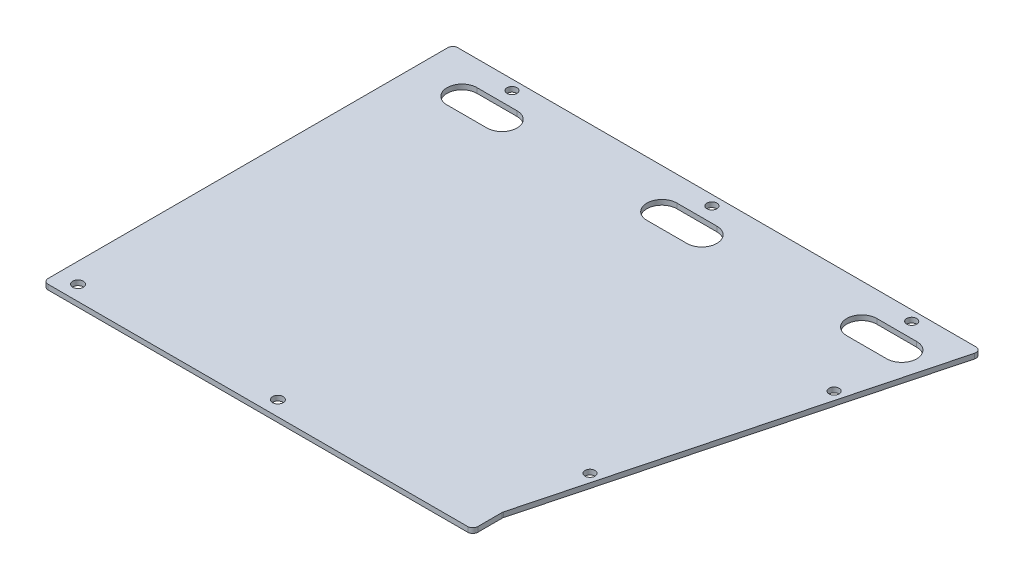
ISO-10303-21;
HEADER;
FILE_DESCRIPTION(('STEP AP214'),'2;1');
FILE_NAME('part.step','',(''),(''),'','','');
FILE_SCHEMA(('AUTOMOTIVE_DESIGN { 1 0 10303 214 1 1 1 1 }'));
ENDSEC;
DATA;
#1=APPLICATION_CONTEXT('core data for automotive mechanical design processes');
#2=APPLICATION_PROTOCOL_DEFINITION('international standard','automotive_design',2000,#1);
#3=PRODUCT_CONTEXT('',#1,'mechanical');
#4=PRODUCT('Part','Part','',(#3));
#5=PRODUCT_RELATED_PRODUCT_CATEGORY('part','',(#4));
#6=PRODUCT_DEFINITION_FORMATION('','',#4);
#7=PRODUCT_DEFINITION_CONTEXT('part definition',#1,'design');
#8=PRODUCT_DEFINITION('design','',#6,#7);
#9=PRODUCT_DEFINITION_SHAPE('','',#8);
#10=(LENGTH_UNIT() NAMED_UNIT(*) SI_UNIT(.MILLI.,.METRE.));
#11=(NAMED_UNIT(*) PLANE_ANGLE_UNIT() SI_UNIT($,.RADIAN.));
#12=(NAMED_UNIT(*) SI_UNIT($,.STERADIAN.) SOLID_ANGLE_UNIT());
#13=UNCERTAINTY_MEASURE_WITH_UNIT(LENGTH_MEASURE(1.E-05),#10,'distance_accuracy_value','');
#14=(GEOMETRIC_REPRESENTATION_CONTEXT(3) GLOBAL_UNCERTAINTY_ASSIGNED_CONTEXT((#13)) GLOBAL_UNIT_ASSIGNED_CONTEXT((#10,
#11,#12)) REPRESENTATION_CONTEXT('',''));
#15=CARTESIAN_POINT('',(0.,0.,0.));
#16=DIRECTION('',(0.,0.,1.));
#17=DIRECTION('',(1.,0.,0.));
#18=AXIS2_PLACEMENT_3D('',#15,#16,#17);
#19=CARTESIAN_POINT('',(0.,3.175,-260.35));
#20=DIRECTION('',(1.,0.,0.));
#21=DIRECTION('',(0.,0.,-1.));
#22=AXIS2_PLACEMENT_3D('',#19,#20,#21);
#23=PLANE('',#22);
#24=DIRECTION('',(0.,0.,1.));
#25=VECTOR('',#24,1.);
#26=CARTESIAN_POINT('',(0.,3.175,-260.35));
#27=LINE('',#26,#25);
#28=CARTESIAN_POINT('',(0.,3.175,-257.175));
#29=VERTEX_POINT('',#28);
#30=CARTESIAN_POINT('',(0.,3.175,-3.17499999999998));
#31=VERTEX_POINT('',#30);
#32=EDGE_CURVE('E327',#29,#31,#27,.T.);
#33=ORIENTED_EDGE('',*,*,#32,.F.);
#34=DIRECTION('',(0.,-1.,0.));
#35=VECTOR('',#34,1.);
#36=CARTESIAN_POINT('',(0.,3.175,-257.175));
#37=LINE('',#36,#35);
#38=CARTESIAN_POINT('',(0.,0.,-257.175));
#39=VERTEX_POINT('',#38);
#40=EDGE_CURVE('E384',#29,#39,#37,.T.);
#41=ORIENTED_EDGE('',*,*,#40,.T.);
#42=DIRECTION('',(0.,0.,1.));
#43=VECTOR('',#42,1.);
#44=CARTESIAN_POINT('',(0.,0.,-260.35));
#45=LINE('',#44,#43);
#46=CARTESIAN_POINT('',(0.,0.,-3.17499999999998));
#47=VERTEX_POINT('',#46);
#48=EDGE_CURVE('E326',#39,#47,#45,.T.);
#49=ORIENTED_EDGE('',*,*,#48,.T.);
#50=DIRECTION('',(0.,-1.,0.));
#51=VECTOR('',#50,1.);
#52=CARTESIAN_POINT('',(0.,3.175,-3.17499999999998));
#53=LINE('',#52,#51);
#54=EDGE_CURVE('E382',#47,#31,#53,.F.);
#55=ORIENTED_EDGE('',*,*,#54,.T.);
#56=EDGE_LOOP('',(#33,#41,#49,#55));
#57=FACE_BOUND('',#56,.T.);
#58=ADVANCED_FACE('F33',(#57),#23,.F.);
#59=CARTESIAN_POINT('',(0.,3.175,0.));
#60=DIRECTION('',(0.,0.,-1.));
#61=DIRECTION('',(-1.,0.,0.));
#62=AXIS2_PLACEMENT_3D('',#59,#60,#61);
#63=PLANE('',#62);
#64=DIRECTION('',(1.,0.,0.));
#65=VECTOR('',#64,1.);
#66=CARTESIAN_POINT('',(0.,3.175,0.));
#67=LINE('',#66,#65);
#68=CARTESIAN_POINT('',(3.175,3.175,0.));
#69=VERTEX_POINT('',#68);
#70=CARTESIAN_POINT('',(269.875,3.175,0.));
#71=VERTEX_POINT('',#70);
#72=EDGE_CURVE('E330',#69,#71,#67,.T.);
#73=ORIENTED_EDGE('',*,*,#72,.F.);
#74=DIRECTION('',(0.,-1.,0.));
#75=VECTOR('',#74,1.);
#76=CARTESIAN_POINT('',(3.175,3.175,0.));
#77=LINE('',#76,#75);
#78=CARTESIAN_POINT('',(3.175,0.,0.));
#79=VERTEX_POINT('',#78);
#80=EDGE_CURVE('E389',#69,#79,#77,.T.);
#81=ORIENTED_EDGE('',*,*,#80,.T.);
#82=DIRECTION('',(1.,0.,0.));
#83=VECTOR('',#82,1.);
#84=CARTESIAN_POINT('',(0.,0.,0.));
#85=LINE('',#84,#83);
#86=CARTESIAN_POINT('',(269.875,0.,0.));
#87=VERTEX_POINT('',#86);
#88=EDGE_CURVE('E346',#79,#87,#85,.T.);
#89=ORIENTED_EDGE('',*,*,#88,.T.);
#90=DIRECTION('',(0.,-1.,0.));
#91=VECTOR('',#90,1.);
#92=CARTESIAN_POINT('',(269.875,3.175,0.));
#93=LINE('',#92,#91);
#94=EDGE_CURVE('E387',#87,#71,#93,.F.);
#95=ORIENTED_EDGE('',*,*,#94,.T.);
#96=EDGE_LOOP('',(#73,#81,#89,#95));
#97=FACE_BOUND('',#96,.T.);
#98=ADVANCED_FACE('F437',(#97),#63,.F.);
#99=CARTESIAN_POINT('',(273.05,3.175,0.));
#100=DIRECTION('',(-1.,0.,0.));
#101=DIRECTION('',(0.,0.,1.));
#102=AXIS2_PLACEMENT_3D('',#99,#100,#101);
#103=PLANE('',#102);
#104=DIRECTION('',(0.,0.,-1.));
#105=VECTOR('',#104,1.);
#106=CARTESIAN_POINT('',(273.05,3.175,0.));
#107=LINE('',#106,#105);
#108=CARTESIAN_POINT('',(273.05,3.175,-3.175));
#109=VERTEX_POINT('',#108);
#110=CARTESIAN_POINT('',(273.05,3.175,-18.6392294827133));
#111=VERTEX_POINT('',#110);
#112=EDGE_CURVE('E334',#109,#111,#107,.T.);
#113=ORIENTED_EDGE('',*,*,#112,.F.);
#114=DIRECTION('',(0.,-1.,0.));
#115=VECTOR('',#114,1.);
#116=CARTESIAN_POINT('',(273.05,3.175,-3.175));
#117=LINE('',#116,#115);
#118=CARTESIAN_POINT('',(273.05,0.,-3.175));
#119=VERTEX_POINT('',#118);
#120=EDGE_CURVE('E394',#109,#119,#117,.T.);
#121=ORIENTED_EDGE('',*,*,#120,.T.);
#122=DIRECTION('',(0.,0.,-1.));
#123=VECTOR('',#122,1.);
#124=CARTESIAN_POINT('',(273.05,0.,0.));
#125=LINE('',#124,#123);
#126=CARTESIAN_POINT('',(273.05,0.,-18.6392294827133));
#127=VERTEX_POINT('',#126);
#128=EDGE_CURVE('E349',#119,#127,#125,.T.);
#129=ORIENTED_EDGE('',*,*,#128,.T.);
#130=DIRECTION('',(0.,-1.,0.));
#131=VECTOR('',#130,1.);
#132=CARTESIAN_POINT('',(273.05,3.175,-18.6392294827133));
#133=LINE('',#132,#131);
#134=EDGE_CURVE('E392',#127,#111,#133,.F.);
#135=ORIENTED_EDGE('',*,*,#134,.T.);
#136=EDGE_LOOP('',(#113,#121,#129,#135));
#137=FACE_BOUND('',#136,.T.);
#138=ADVANCED_FACE('F405',(#137),#103,.F.);
#139=CARTESIAN_POINT('',(273.05,3.175,-19.05));
#140=DIRECTION('',(-0.967074537262646,0.,-0.254493299279644));
#141=DIRECTION('',(-0.254493299279644,0.,0.967074537262646));
#142=AXIS2_PLACEMENT_3D('',#139,#140,#141);
#143=PLANE('',#142);
#144=DIRECTION('',(0.254493299279644,0.,-0.967074537262646));
#145=VECTOR('',#144,1.);
#146=CARTESIAN_POINT('',(273.05,0.,-19.05));
#147=LINE('',#146,#145);
#148=CARTESIAN_POINT('',(273.154538344191,0.,-19.4472457079262));
#149=VERTEX_POINT('',#148);
#150=CARTESIAN_POINT('',(335.50183783547,0.,-256.366983774787));
#151=VERTEX_POINT('',#150);
#152=EDGE_CURVE('E352',#149,#151,#147,.T.);
#153=ORIENTED_EDGE('',*,*,#152,.T.);
#154=DIRECTION('',(0.,-1.,0.));
#155=VECTOR('',#154,1.);
#156=CARTESIAN_POINT('',(335.50183783547,3.175,-256.366983774787));
#157=LINE('',#156,#155);
#158=CARTESIAN_POINT('',(335.50183783547,3.175,-256.366983774787));
#159=VERTEX_POINT('',#158);
#160=EDGE_CURVE('E372',#151,#159,#157,.F.);
#161=ORIENTED_EDGE('',*,*,#160,.T.);
#162=DIRECTION('',(0.254493299279644,0.,-0.967074537262646));
#163=VECTOR('',#162,1.);
#164=CARTESIAN_POINT('',(273.05,3.175,-19.05));
#165=LINE('',#164,#163);
#166=CARTESIAN_POINT('',(273.154538344191,3.175,-19.4472457079262));
#167=VERTEX_POINT('',#166);
#168=EDGE_CURVE('E337',#167,#159,#165,.T.);
#169=ORIENTED_EDGE('',*,*,#168,.F.);
#170=DIRECTION('',(0.,-1.,0.));
#171=VECTOR('',#170,1.);
#172=CARTESIAN_POINT('',(273.154538344191,0.,-19.4472457079262));
#173=LINE('',#172,#171);
#174=EDGE_CURVE('E369',#167,#149,#173,.T.);
#175=ORIENTED_EDGE('',*,*,#174,.T.);
#176=EDGE_LOOP('',(#153,#161,#169,#175));
#177=FACE_BOUND('',#176,.T.);
#178=ADVANCED_FACE('F413',(#177),#143,.F.);
#179=CARTESIAN_POINT('',(336.55,3.175,-260.35));
#180=DIRECTION('',(0.,0.,1.));
#181=DIRECTION('',(1.,0.,0.));
#182=AXIS2_PLACEMENT_3D('',#179,#180,#181);
#183=PLANE('',#182);
#184=DIRECTION('',(-1.,0.,0.));
#185=VECTOR('',#184,1.);
#186=CARTESIAN_POINT('',(336.55,3.175,-260.35));
#187=LINE('',#186,#185);
#188=CARTESIAN_POINT('',(332.431376179661,3.175,-260.35));
#189=VERTEX_POINT('',#188);
#190=CARTESIAN_POINT('',(3.17499999999998,3.175,-260.35));
#191=VERTEX_POINT('',#190);
#192=EDGE_CURVE('E340',#189,#191,#187,.T.);
#193=ORIENTED_EDGE('',*,*,#192,.F.);
#194=DIRECTION('',(0.,-1.,0.));
#195=VECTOR('',#194,1.);
#196=CARTESIAN_POINT('',(332.431376179661,3.175,-260.35));
#197=LINE('',#196,#195);
#198=CARTESIAN_POINT('',(332.431376179661,0.,-260.35));
#199=VERTEX_POINT('',#198);
#200=EDGE_CURVE('E358',#189,#199,#197,.T.);
#201=ORIENTED_EDGE('',*,*,#200,.T.);
#202=DIRECTION('',(-1.,0.,0.));
#203=VECTOR('',#202,1.);
#204=CARTESIAN_POINT('',(336.55,0.,-260.35));
#205=LINE('',#204,#203);
#206=CARTESIAN_POINT('',(3.17499999999998,0.,-260.35));
#207=VERTEX_POINT('',#206);
#208=EDGE_CURVE('E331',#199,#207,#205,.T.);
#209=ORIENTED_EDGE('',*,*,#208,.T.);
#210=DIRECTION('',(0.,-1.,0.));
#211=VECTOR('',#210,1.);
#212=CARTESIAN_POINT('',(3.17499999999998,3.175,-260.35));
#213=LINE('',#212,#211);
#214=EDGE_CURVE('E343',#207,#191,#213,.F.);
#215=ORIENTED_EDGE('',*,*,#214,.T.);
#216=EDGE_LOOP('',(#193,#201,#209,#215));
#217=FACE_BOUND('',#216,.T.);
#218=ADVANCED_FACE('F421',(#217),#183,.F.);
#219=CARTESIAN_POINT('',(0.,3.175,0.));
#220=DIRECTION('',(0.,1.,0.));
#221=DIRECTION('',(0.,0.,1.));
#222=AXIS2_PLACEMENT_3D('',#219,#220,#221);
#223=PLANE('',#222);
#224=CARTESIAN_POINT('',(285.278188089831,3.17500000000006,-234.95));
#225=DIRECTION('',(0.,1.,0.));
#226=DIRECTION('',(-1.,0.,0.));
#227=AXIS2_PLACEMENT_3D('',#224,#225,#226);
#228=CIRCLE('',#227,9.52500000000001);
#229=CARTESIAN_POINT('',(285.278188089831,3.17500000000006,-244.475));
#230=VERTEX_POINT('',#229);
#231=CARTESIAN_POINT('',(285.278188089831,3.175,-225.425));
#232=VERTEX_POINT('',#231);
#233=EDGE_CURVE('E48',#230,#232,#228,.T.);
#234=ORIENTED_EDGE('',*,*,#233,.F.);
#235=DIRECTION('',(-1.,0.,0.));
#236=VECTOR('',#235,1.);
#237=CARTESIAN_POINT('',(285.278188089831,3.17500000000006,-244.475));
#238=LINE('',#237,#236);
#239=CARTESIAN_POINT('',(310.678188089831,3.17500000000007,-244.475));
#240=VERTEX_POINT('',#239);
#241=EDGE_CURVE('E260',#240,#230,#238,.T.);
#242=ORIENTED_EDGE('',*,*,#241,.F.);
#243=CARTESIAN_POINT('',(310.678188089831,3.17500000000007,-234.95));
#244=DIRECTION('',(0.,1.,0.));
#245=DIRECTION('',(-1.,0.,0.));
#246=AXIS2_PLACEMENT_3D('',#243,#244,#245);
#247=CIRCLE('',#246,9.52500000000001);
#248=CARTESIAN_POINT('',(310.678188089831,3.17500000000007,-225.425));
#249=VERTEX_POINT('',#248);
#250=EDGE_CURVE('E274',#249,#240,#247,.T.);
#251=ORIENTED_EDGE('',*,*,#250,.F.);
#252=DIRECTION('',(1.,0.,0.));
#253=VECTOR('',#252,1.);
#254=CARTESIAN_POINT('',(285.278188089831,3.17500000000006,-225.425));
#255=LINE('',#254,#253);
#256=EDGE_CURVE('E271',#232,#249,#255,.T.);
#257=ORIENTED_EDGE('',*,*,#256,.F.);
#258=EDGE_LOOP('',(#234,#242,#251,#257));
#259=FACE_BOUND('',#258,.T.);
#260=CARTESIAN_POINT('',(158.278188089831,3.17500000000003,-234.95));
#261=DIRECTION('',(0.,1.,0.));
#262=DIRECTION('',(-1.,0.,0.));
#263=AXIS2_PLACEMENT_3D('',#260,#261,#262);
#264=CIRCLE('',#263,9.52500000000001);
#265=CARTESIAN_POINT('',(158.278188089831,3.17500000000003,-244.475));
#266=VERTEX_POINT('',#265);
#267=CARTESIAN_POINT('',(158.278188089831,3.175,-225.425));
#268=VERTEX_POINT('',#267);
#269=EDGE_CURVE('E56',#266,#268,#264,.T.);
#270=ORIENTED_EDGE('',*,*,#269,.F.);
#271=DIRECTION('',(-1.,0.,0.));
#272=VECTOR('',#271,1.);
#273=CARTESIAN_POINT('',(158.278188089831,3.17500000000003,-244.475));
#274=LINE('',#273,#272);
#275=CARTESIAN_POINT('',(183.678188089831,3.17500000000004,-244.475));
#276=VERTEX_POINT('',#275);
#277=EDGE_CURVE('E230',#276,#266,#274,.T.);
#278=ORIENTED_EDGE('',*,*,#277,.F.);
#279=CARTESIAN_POINT('',(183.678188089831,3.17500000000004,-234.95));
#280=DIRECTION('',(0.,1.,0.));
#281=DIRECTION('',(-1.,0.,0.));
#282=AXIS2_PLACEMENT_3D('',#279,#280,#281);
#283=CIRCLE('',#282,9.52500000000001);
#284=CARTESIAN_POINT('',(183.678188089831,3.17500000000004,-225.425));
#285=VERTEX_POINT('',#284);
#286=EDGE_CURVE('E245',#285,#276,#283,.T.);
#287=ORIENTED_EDGE('',*,*,#286,.F.);
#288=DIRECTION('',(1.,0.,0.));
#289=VECTOR('',#288,1.);
#290=CARTESIAN_POINT('',(158.278188089831,3.17500000000003,-225.425));
#291=LINE('',#290,#289);
#292=EDGE_CURVE('E241',#268,#285,#291,.T.);
#293=ORIENTED_EDGE('',*,*,#292,.F.);
#294=EDGE_LOOP('',(#270,#278,#287,#293));
#295=FACE_BOUND('',#294,.T.);
#296=CARTESIAN_POINT('',(31.2781880898307,3.17500000000001,-234.95));
#297=DIRECTION('',(0.,1.,0.));
#298=DIRECTION('',(-1.,0.,0.));
#299=AXIS2_PLACEMENT_3D('',#296,#297,#298);
#300=CIRCLE('',#299,9.52500000000001);
#301=CARTESIAN_POINT('',(31.2781880898307,3.17500000000001,-244.475));
#302=VERTEX_POINT('',#301);
#303=CARTESIAN_POINT('',(31.2781880898307,3.175,-225.425));
#304=VERTEX_POINT('',#303);
#305=EDGE_CURVE('E188',#302,#304,#300,.T.);
#306=ORIENTED_EDGE('',*,*,#305,.F.);
#307=DIRECTION('',(-1.,0.,0.));
#308=VECTOR('',#307,1.);
#309=CARTESIAN_POINT('',(31.2781880898307,3.17500000000001,-244.475));
#310=LINE('',#309,#308);
#311=CARTESIAN_POINT('',(56.6781880898307,3.17500000000001,-244.475));
#312=VERTEX_POINT('',#311);
#313=EDGE_CURVE('E206',#312,#302,#310,.T.);
#314=ORIENTED_EDGE('',*,*,#313,.F.);
#315=CARTESIAN_POINT('',(56.6781880898307,3.17500000000001,-234.95));
#316=DIRECTION('',(0.,1.,0.));
#317=DIRECTION('',(-1.,0.,0.));
#318=AXIS2_PLACEMENT_3D('',#315,#316,#317);
#319=CIRCLE('',#318,9.52500000000001);
#320=CARTESIAN_POINT('',(56.6781880898307,3.17500000000001,-225.425));
#321=VERTEX_POINT('',#320);
#322=EDGE_CURVE('E209',#321,#312,#319,.T.);
#323=ORIENTED_EDGE('',*,*,#322,.F.);
#324=DIRECTION('',(1.,0.,0.));
#325=VECTOR('',#324,1.);
#326=CARTESIAN_POINT('',(31.2781880898307,3.17500000000001,-225.425));
#327=LINE('',#326,#325);
#328=EDGE_CURVE('E215',#304,#321,#327,.T.);
#329=ORIENTED_EDGE('',*,*,#328,.F.);
#330=EDGE_LOOP('',(#306,#314,#323,#329));
#331=FACE_BOUND('',#330,.T.);
#332=CARTESIAN_POINT('',(12.7,3.175,-9.525));
#333=DIRECTION('',(0.,1.,0.));
#334=DIRECTION('',(0.,0.,1.));
#335=AXIS2_PLACEMENT_3D('',#332,#333,#334);
#336=CIRCLE('',#335,3.373501);
#337=CARTESIAN_POINT('',(12.7,3.175,-6.151499));
#338=VERTEX_POINT('',#337);
#339=EDGE_CURVE('E222',#338,#338,#336,.T.);
#340=ORIENTED_EDGE('',*,*,#339,.F.);
#341=EDGE_LOOP('',(#340));
#342=FACE_BOUND('',#341,.T.);
#343=CARTESIAN_POINT('',(139.7,3.175,-9.525));
#344=DIRECTION('',(0.,1.,0.));
#345=DIRECTION('',(0.,0.,1.));
#346=AXIS2_PLACEMENT_3D('',#343,#344,#345);
#347=CIRCLE('',#346,3.373501);
#348=CARTESIAN_POINT('',(139.7,3.175,-6.151499));
#349=VERTEX_POINT('',#348);
#350=EDGE_CURVE('E290',#349,#349,#347,.T.);
#351=ORIENTED_EDGE('',*,*,#350,.F.);
#352=EDGE_LOOP('',(#351));
#353=FACE_BOUND('',#352,.T.);
#354=CARTESIAN_POINT('',(43.9781880898307,3.175,-254.));
#355=DIRECTION('',(0.,1.,0.));
#356=DIRECTION('',(0.,0.,1.));
#357=AXIS2_PLACEMENT_3D('',#354,#355,#356);
#358=CIRCLE('',#357,3.175);
#359=CARTESIAN_POINT('',(43.9781880898307,3.175,-250.825));
#360=VERTEX_POINT('',#359);
#361=EDGE_CURVE('E296',#360,#360,#358,.T.);
#362=ORIENTED_EDGE('',*,*,#361,.F.);
#363=EDGE_LOOP('',(#362));
#364=FACE_BOUND('',#363,.T.);
#365=CARTESIAN_POINT('',(170.978188089831,3.175,-254.));
#366=DIRECTION('',(0.,1.,0.));
#367=DIRECTION('',(0.,0.,1.));
#368=AXIS2_PLACEMENT_3D('',#365,#366,#367);
#369=CIRCLE('',#368,3.17500000000001);
#370=CARTESIAN_POINT('',(170.978188089831,3.175,-250.825));
#371=VERTEX_POINT('',#370);
#372=EDGE_CURVE('E302',#371,#371,#369,.T.);
#373=ORIENTED_EDGE('',*,*,#372,.F.);
#374=EDGE_LOOP('',(#373));
#375=FACE_BOUND('',#374,.T.);
#376=CARTESIAN_POINT('',(297.978188089831,3.175,-254.));
#377=DIRECTION('',(0.,1.,0.));
#378=DIRECTION('',(0.,0.,1.));
#379=AXIS2_PLACEMENT_3D('',#376,#377,#378);
#380=CIRCLE('',#379,3.17499999999998);
#381=CARTESIAN_POINT('',(297.978188089831,3.175,-250.825));
#382=VERTEX_POINT('',#381);
#383=EDGE_CURVE('E308',#382,#382,#380,.T.);
#384=ORIENTED_EDGE('',*,*,#383,.F.);
#385=EDGE_LOOP('',(#384));
#386=FACE_BOUND('',#385,.T.);
#387=CARTESIAN_POINT('',(311.721536550529,3.175,-190.953379926582));
#388=DIRECTION('',(0.,1.,0.));
#389=DIRECTION('',(0.,0.,1.));
#390=AXIS2_PLACEMENT_3D('',#387,#388,#389);
#391=CIRCLE('',#390,3.17499999999998);
#392=CARTESIAN_POINT('',(311.721536550529,3.175,-187.778379926582));
#393=VERTEX_POINT('',#392);
#394=EDGE_CURVE('E314',#393,#393,#391,.T.);
#395=ORIENTED_EDGE('',*,*,#394,.F.);
#396=EDGE_LOOP('',(#395));
#397=FACE_BOUND('',#396,.T.);
#398=CARTESIAN_POINT('',(279.400887542014,3.175,-68.1349136942254));
#399=DIRECTION('',(0.,1.,0.));
#400=DIRECTION('',(0.,0.,1.));
#401=AXIS2_PLACEMENT_3D('',#398,#399,#400);
#402=CIRCLE('',#401,3.17499999999998);
#403=CARTESIAN_POINT('',(279.400887542014,3.175,-64.9599136942254));
#404=VERTEX_POINT('',#403);
#405=EDGE_CURVE('E320',#404,#404,#402,.T.);
#406=ORIENTED_EDGE('',*,*,#405,.F.);
#407=EDGE_LOOP('',(#406));
#408=FACE_BOUND('',#407,.T.);
#409=ORIENTED_EDGE('',*,*,#168,.T.);
#410=CARTESIAN_POINT('',(332.431376179661,3.175,-257.175));
#411=DIRECTION('',(0.,1.,0.));
#412=DIRECTION('',(0.,0.,1.));
#413=AXIS2_PLACEMENT_3D('',#410,#411,#412);
#414=CIRCLE('',#413,3.175);
#415=EDGE_CURVE('E380',#159,#189,#414,.T.);
#416=ORIENTED_EDGE('',*,*,#415,.T.);
#417=ORIENTED_EDGE('',*,*,#192,.T.);
#418=CARTESIAN_POINT('',(3.175,3.175,-257.175));
#419=DIRECTION('',(0.,1.,0.));
#420=DIRECTION('',(0.,0.,1.));
#421=AXIS2_PLACEMENT_3D('',#418,#419,#420);
#422=CIRCLE('',#421,3.175);
#423=EDGE_CURVE('E378',#191,#29,#422,.T.);
#424=ORIENTED_EDGE('',*,*,#423,.T.);
#425=ORIENTED_EDGE('',*,*,#32,.T.);
#426=CARTESIAN_POINT('',(3.175,3.175,-3.175));
#427=DIRECTION('',(0.,1.,0.));
#428=DIRECTION('',(0.,0.,1.));
#429=AXIS2_PLACEMENT_3D('',#426,#427,#428);
#430=CIRCLE('',#429,3.175);
#431=EDGE_CURVE('E376',#31,#69,#430,.T.);
#432=ORIENTED_EDGE('',*,*,#431,.T.);
#433=ORIENTED_EDGE('',*,*,#72,.T.);
#434=CARTESIAN_POINT('',(269.875,3.175,-3.175));
#435=DIRECTION('',(0.,1.,0.));
#436=DIRECTION('',(0.,0.,1.));
#437=AXIS2_PLACEMENT_3D('',#434,#435,#436);
#438=CIRCLE('',#437,3.175);
#439=EDGE_CURVE('E374',#71,#109,#438,.T.);
#440=ORIENTED_EDGE('',*,*,#439,.T.);
#441=ORIENTED_EDGE('',*,*,#112,.T.);
#442=CARTESIAN_POINT('',(276.225,3.175,-18.6392294827133));
#443=DIRECTION('',(0.,1.,0.));
#444=DIRECTION('',(0.,0.,1.));
#445=AXIS2_PLACEMENT_3D('',#442,#443,#444);
#446=CIRCLE('',#445,3.175);
#447=EDGE_CURVE('E11',#111,#167,#446,.F.);
#448=ORIENTED_EDGE('',*,*,#447,.T.);
#449=EDGE_LOOP('',(#409,#416,#417,#424,#425,#432,#433,#440,#441,#448));
#450=FACE_BOUND('',#449,.T.);
#451=ADVANCED_FACE('F410',(#259,#295,#331,#342,#353,#364,#375,#386,#397,#408,#450),#223,.T.);
#452=CARTESIAN_POINT('',(0.,0.,0.));
#453=DIRECTION('',(0.,1.,0.));
#454=DIRECTION('',(0.,0.,1.));
#455=AXIS2_PLACEMENT_3D('',#452,#453,#454);
#456=PLANE('',#455);
#457=DIRECTION('',(-1.,0.,0.));
#458=VECTOR('',#457,1.);
#459=CARTESIAN_POINT('',(285.278188089831,0.,-244.475));
#460=LINE('',#459,#458);
#461=CARTESIAN_POINT('',(310.678188089831,0.,-244.475));
#462=VERTEX_POINT('',#461);
#463=CARTESIAN_POINT('',(285.278188089831,0.,-244.475));
#464=VERTEX_POINT('',#463);
#465=EDGE_CURVE('E266',#462,#464,#460,.T.);
#466=ORIENTED_EDGE('',*,*,#465,.T.);
#467=CARTESIAN_POINT('',(285.278188089831,0.,-234.95));
#468=DIRECTION('',(0.,1.,0.));
#469=DIRECTION('',(-1.,0.,0.));
#470=AXIS2_PLACEMENT_3D('',#467,#468,#469);
#471=CIRCLE('',#470,9.52500000000001);
#472=CARTESIAN_POINT('',(285.278188089831,0.,-225.425));
#473=VERTEX_POINT('',#472);
#474=EDGE_CURVE('E256',#464,#473,#471,.T.);
#475=ORIENTED_EDGE('',*,*,#474,.T.);
#476=DIRECTION('',(1.,0.,0.));
#477=VECTOR('',#476,1.);
#478=CARTESIAN_POINT('',(285.278188089831,0.,-225.425));
#479=LINE('',#478,#477);
#480=CARTESIAN_POINT('',(310.678188089831,0.,-225.425));
#481=VERTEX_POINT('',#480);
#482=EDGE_CURVE('E259',#473,#481,#479,.T.);
#483=ORIENTED_EDGE('',*,*,#482,.T.);
#484=CARTESIAN_POINT('',(310.678188089831,0.,-234.95));
#485=DIRECTION('',(0.,1.,0.));
#486=DIRECTION('',(-1.,0.,0.));
#487=AXIS2_PLACEMENT_3D('',#484,#485,#486);
#488=CIRCLE('',#487,9.52500000000001);
#489=EDGE_CURVE('E263',#481,#462,#488,.T.);
#490=ORIENTED_EDGE('',*,*,#489,.T.);
#491=EDGE_LOOP('',(#466,#475,#483,#490));
#492=FACE_BOUND('',#491,.T.);
#493=DIRECTION('',(-1.,0.,0.));
#494=VECTOR('',#493,1.);
#495=CARTESIAN_POINT('',(158.278188089831,0.,-244.475));
#496=LINE('',#495,#494);
#497=CARTESIAN_POINT('',(183.678188089831,0.,-244.475));
#498=VERTEX_POINT('',#497);
#499=CARTESIAN_POINT('',(158.278188089831,0.,-244.475));
#500=VERTEX_POINT('',#499);
#501=EDGE_CURVE('E236',#498,#500,#496,.T.);
#502=ORIENTED_EDGE('',*,*,#501,.T.);
#503=CARTESIAN_POINT('',(158.278188089831,0.,-234.95));
#504=DIRECTION('',(0.,1.,0.));
#505=DIRECTION('',(-1.,0.,0.));
#506=AXIS2_PLACEMENT_3D('',#503,#504,#505);
#507=CIRCLE('',#506,9.52500000000001);
#508=CARTESIAN_POINT('',(158.278188089831,0.,-225.425));
#509=VERTEX_POINT('',#508);
#510=EDGE_CURVE('E226',#500,#509,#507,.T.);
#511=ORIENTED_EDGE('',*,*,#510,.T.);
#512=DIRECTION('',(1.,0.,0.));
#513=VECTOR('',#512,1.);
#514=CARTESIAN_POINT('',(158.278188089831,0.,-225.425));
#515=LINE('',#514,#513);
#516=CARTESIAN_POINT('',(183.678188089831,0.,-225.425));
#517=VERTEX_POINT('',#516);
#518=EDGE_CURVE('E229',#509,#517,#515,.T.);
#519=ORIENTED_EDGE('',*,*,#518,.T.);
#520=CARTESIAN_POINT('',(183.678188089831,0.,-234.95));
#521=DIRECTION('',(0.,1.,0.));
#522=DIRECTION('',(-1.,0.,0.));
#523=AXIS2_PLACEMENT_3D('',#520,#521,#522);
#524=CIRCLE('',#523,9.52500000000001);
#525=EDGE_CURVE('E233',#517,#498,#524,.T.);
#526=ORIENTED_EDGE('',*,*,#525,.T.);
#527=EDGE_LOOP('',(#502,#511,#519,#526));
#528=FACE_BOUND('',#527,.T.);
#529=DIRECTION('',(-1.,0.,0.));
#530=VECTOR('',#529,1.);
#531=CARTESIAN_POINT('',(31.2781880898307,0.,-244.475));
#532=LINE('',#531,#530);
#533=CARTESIAN_POINT('',(56.6781880898307,0.,-244.475));
#534=VERTEX_POINT('',#533);
#535=CARTESIAN_POINT('',(31.2781880898307,0.,-244.475));
#536=VERTEX_POINT('',#535);
#537=EDGE_CURVE('E193',#534,#536,#532,.T.);
#538=ORIENTED_EDGE('',*,*,#537,.T.);
#539=CARTESIAN_POINT('',(31.2781880898307,0.,-234.95));
#540=DIRECTION('',(0.,1.,0.));
#541=DIRECTION('',(-1.,0.,0.));
#542=AXIS2_PLACEMENT_3D('',#539,#540,#541);
#543=CIRCLE('',#542,9.52500000000001);
#544=CARTESIAN_POINT('',(31.2781880898307,0.,-225.425));
#545=VERTEX_POINT('',#544);
#546=EDGE_CURVE('E185',#536,#545,#543,.T.);
#547=ORIENTED_EDGE('',*,*,#546,.T.);
#548=DIRECTION('',(1.,0.,0.));
#549=VECTOR('',#548,1.);
#550=CARTESIAN_POINT('',(31.2781880898307,0.,-225.425));
#551=LINE('',#550,#549);
#552=CARTESIAN_POINT('',(56.6781880898307,0.,-225.425));
#553=VERTEX_POINT('',#552);
#554=EDGE_CURVE('E197',#545,#553,#551,.T.);
#555=ORIENTED_EDGE('',*,*,#554,.T.);
#556=CARTESIAN_POINT('',(56.6781880898307,0.,-234.95));
#557=DIRECTION('',(0.,1.,0.));
#558=DIRECTION('',(-1.,0.,0.));
#559=AXIS2_PLACEMENT_3D('',#556,#557,#558);
#560=CIRCLE('',#559,9.52500000000001);
#561=EDGE_CURVE('E201',#553,#534,#560,.T.);
#562=ORIENTED_EDGE('',*,*,#561,.T.);
#563=EDGE_LOOP('',(#538,#547,#555,#562));
#564=FACE_BOUND('',#563,.T.);
#565=CARTESIAN_POINT('',(12.7,0.,-9.525));
#566=DIRECTION('',(0.,1.,0.));
#567=DIRECTION('',(0.,0.,1.));
#568=AXIS2_PLACEMENT_3D('',#565,#566,#567);
#569=CIRCLE('',#568,3.373501);
#570=CARTESIAN_POINT('',(12.7,0.,-6.151499));
#571=VERTEX_POINT('',#570);
#572=EDGE_CURVE('E287',#571,#571,#569,.T.);
#573=ORIENTED_EDGE('',*,*,#572,.T.);
#574=EDGE_LOOP('',(#573));
#575=FACE_BOUND('',#574,.T.);
#576=CARTESIAN_POINT('',(139.7,0.,-9.525));
#577=DIRECTION('',(0.,1.,0.));
#578=DIRECTION('',(0.,0.,1.));
#579=AXIS2_PLACEMENT_3D('',#576,#577,#578);
#580=CIRCLE('',#579,3.373501);
#581=CARTESIAN_POINT('',(139.7,0.,-6.151499));
#582=VERTEX_POINT('',#581);
#583=EDGE_CURVE('E293',#582,#582,#580,.T.);
#584=ORIENTED_EDGE('',*,*,#583,.T.);
#585=EDGE_LOOP('',(#584));
#586=FACE_BOUND('',#585,.T.);
#587=CARTESIAN_POINT('',(43.9781880898307,0.,-254.));
#588=DIRECTION('',(0.,1.,0.));
#589=DIRECTION('',(0.,0.,1.));
#590=AXIS2_PLACEMENT_3D('',#587,#588,#589);
#591=CIRCLE('',#590,3.175);
#592=CARTESIAN_POINT('',(43.9781880898307,0.,-250.825));
#593=VERTEX_POINT('',#592);
#594=EDGE_CURVE('E299',#593,#593,#591,.T.);
#595=ORIENTED_EDGE('',*,*,#594,.T.);
#596=EDGE_LOOP('',(#595));
#597=FACE_BOUND('',#596,.T.);
#598=CARTESIAN_POINT('',(170.978188089831,0.,-254.));
#599=DIRECTION('',(0.,1.,0.));
#600=DIRECTION('',(0.,0.,1.));
#601=AXIS2_PLACEMENT_3D('',#598,#599,#600);
#602=CIRCLE('',#601,3.17500000000001);
#603=CARTESIAN_POINT('',(170.978188089831,0.,-250.825));
#604=VERTEX_POINT('',#603);
#605=EDGE_CURVE('E305',#604,#604,#602,.T.);
#606=ORIENTED_EDGE('',*,*,#605,.T.);
#607=EDGE_LOOP('',(#606));
#608=FACE_BOUND('',#607,.T.);
#609=CARTESIAN_POINT('',(297.978188089831,0.,-254.));
#610=DIRECTION('',(0.,1.,0.));
#611=DIRECTION('',(0.,0.,1.));
#612=AXIS2_PLACEMENT_3D('',#609,#610,#611);
#613=CIRCLE('',#612,3.17499999999998);
#614=CARTESIAN_POINT('',(297.978188089831,0.,-250.825));
#615=VERTEX_POINT('',#614);
#616=EDGE_CURVE('E311',#615,#615,#613,.T.);
#617=ORIENTED_EDGE('',*,*,#616,.T.);
#618=EDGE_LOOP('',(#617));
#619=FACE_BOUND('',#618,.T.);
#620=CARTESIAN_POINT('',(311.721536550529,0.,-190.953379926582));
#621=DIRECTION('',(0.,1.,0.));
#622=DIRECTION('',(0.,0.,1.));
#623=AXIS2_PLACEMENT_3D('',#620,#621,#622);
#624=CIRCLE('',#623,3.17499999999998);
#625=CARTESIAN_POINT('',(311.721536550529,0.,-187.778379926582));
#626=VERTEX_POINT('',#625);
#627=EDGE_CURVE('E317',#626,#626,#624,.T.);
#628=ORIENTED_EDGE('',*,*,#627,.T.);
#629=EDGE_LOOP('',(#628));
#630=FACE_BOUND('',#629,.T.);
#631=CARTESIAN_POINT('',(279.400887542014,0.,-68.1349136942254));
#632=DIRECTION('',(0.,1.,0.));
#633=DIRECTION('',(0.,0.,1.));
#634=AXIS2_PLACEMENT_3D('',#631,#632,#633);
#635=CIRCLE('',#634,3.17499999999998);
#636=CARTESIAN_POINT('',(279.400887542014,0.,-64.9599136942254));
#637=VERTEX_POINT('',#636);
#638=EDGE_CURVE('E323',#637,#637,#635,.T.);
#639=ORIENTED_EDGE('',*,*,#638,.T.);
#640=EDGE_LOOP('',(#639));
#641=FACE_BOUND('',#640,.T.);
#642=ORIENTED_EDGE('',*,*,#208,.F.);
#643=CARTESIAN_POINT('',(332.431376179661,0.,-257.175));
#644=DIRECTION('',(0.,1.,0.));
#645=DIRECTION('',(0.,0.,1.));
#646=AXIS2_PLACEMENT_3D('',#643,#644,#645);
#647=CIRCLE('',#646,3.175);
#648=EDGE_CURVE('E367',#199,#151,#647,.F.);
#649=ORIENTED_EDGE('',*,*,#648,.T.);
#650=ORIENTED_EDGE('',*,*,#152,.F.);
#651=CARTESIAN_POINT('',(276.225,0.,-18.6392294827133));
#652=DIRECTION('',(0.,1.,0.));
#653=DIRECTION('',(0.,0.,1.));
#654=AXIS2_PLACEMENT_3D('',#651,#652,#653);
#655=CIRCLE('',#654,3.175);
#656=EDGE_CURVE('E41',#149,#127,#655,.T.);
#657=ORIENTED_EDGE('',*,*,#656,.T.);
#658=ORIENTED_EDGE('',*,*,#128,.F.);
#659=CARTESIAN_POINT('',(269.875,0.,-3.175));
#660=DIRECTION('',(0.,1.,0.));
#661=DIRECTION('',(0.,0.,1.));
#662=AXIS2_PLACEMENT_3D('',#659,#660,#661);
#663=CIRCLE('',#662,3.175);
#664=EDGE_CURVE('E361',#119,#87,#663,.F.);
#665=ORIENTED_EDGE('',*,*,#664,.T.);
#666=ORIENTED_EDGE('',*,*,#88,.F.);
#667=CARTESIAN_POINT('',(3.175,0.,-3.175));
#668=DIRECTION('',(0.,1.,0.));
#669=DIRECTION('',(0.,0.,1.));
#670=AXIS2_PLACEMENT_3D('',#667,#668,#669);
#671=CIRCLE('',#670,3.175);
#672=EDGE_CURVE('E363',#79,#47,#671,.F.);
#673=ORIENTED_EDGE('',*,*,#672,.T.);
#674=ORIENTED_EDGE('',*,*,#48,.F.);
#675=CARTESIAN_POINT('',(3.175,0.,-257.175));
#676=DIRECTION('',(0.,1.,0.));
#677=DIRECTION('',(0.,0.,1.));
#678=AXIS2_PLACEMENT_3D('',#675,#676,#677);
#679=CIRCLE('',#678,3.175);
#680=EDGE_CURVE('E365',#39,#207,#679,.F.);
#681=ORIENTED_EDGE('',*,*,#680,.T.);
#682=EDGE_LOOP('',(#642,#649,#650,#657,#658,#665,#666,#673,#674,#681));
#683=FACE_BOUND('',#682,.T.);
#684=ADVANCED_FACE('F203',(#492,#528,#564,#575,#586,#597,#608,#619,#630,#641,#683),#456,.F.);
#685=CARTESIAN_POINT('',(332.431376179661,3.175,-257.175));
#686=DIRECTION('',(0.,-1.,0.));
#687=DIRECTION('',(0.,0.,-1.));
#688=AXIS2_PLACEMENT_3D('',#685,#686,#687);
#689=CYLINDRICAL_SURFACE('',#688,3.175);
#690=ORIENTED_EDGE('',*,*,#415,.F.);
#691=ORIENTED_EDGE('',*,*,#160,.F.);
#692=ORIENTED_EDGE('',*,*,#648,.F.);
#693=ORIENTED_EDGE('',*,*,#200,.F.);
#694=EDGE_LOOP('',(#690,#691,#692,#693));
#695=FACE_BOUND('',#694,.T.);
#696=ADVANCED_FACE('F416',(#695),#689,.T.);
#697=CARTESIAN_POINT('',(3.175,3.175,-257.175));
#698=DIRECTION('',(0.,-1.,0.));
#699=DIRECTION('',(0.,0.,-1.));
#700=AXIS2_PLACEMENT_3D('',#697,#698,#699);
#701=CYLINDRICAL_SURFACE('',#700,3.175);
#702=ORIENTED_EDGE('',*,*,#423,.F.);
#703=ORIENTED_EDGE('',*,*,#214,.F.);
#704=ORIENTED_EDGE('',*,*,#680,.F.);
#705=ORIENTED_EDGE('',*,*,#40,.F.);
#706=EDGE_LOOP('',(#702,#703,#704,#705));
#707=FACE_BOUND('',#706,.T.);
#708=ADVANCED_FACE('F424',(#707),#701,.T.);
#709=CARTESIAN_POINT('',(3.175,3.175,-3.175));
#710=DIRECTION('',(0.,-1.,0.));
#711=DIRECTION('',(0.,0.,-1.));
#712=AXIS2_PLACEMENT_3D('',#709,#710,#711);
#713=CYLINDRICAL_SURFACE('',#712,3.175);
#714=ORIENTED_EDGE('',*,*,#431,.F.);
#715=ORIENTED_EDGE('',*,*,#54,.F.);
#716=ORIENTED_EDGE('',*,*,#672,.F.);
#717=ORIENTED_EDGE('',*,*,#80,.F.);
#718=EDGE_LOOP('',(#714,#715,#716,#717));
#719=FACE_BOUND('',#718,.T.);
#720=ADVANCED_FACE('F432',(#719),#713,.T.);
#721=CARTESIAN_POINT('',(269.875,3.175,-3.175));
#722=DIRECTION('',(0.,-1.,0.));
#723=DIRECTION('',(0.,0.,-1.));
#724=AXIS2_PLACEMENT_3D('',#721,#722,#723);
#725=CYLINDRICAL_SURFACE('',#724,3.175);
#726=ORIENTED_EDGE('',*,*,#439,.F.);
#727=ORIENTED_EDGE('',*,*,#94,.F.);
#728=ORIENTED_EDGE('',*,*,#664,.F.);
#729=ORIENTED_EDGE('',*,*,#120,.F.);
#730=EDGE_LOOP('',(#726,#727,#728,#729));
#731=FACE_BOUND('',#730,.T.);
#732=ADVANCED_FACE('F441',(#731),#725,.T.);
#733=CARTESIAN_POINT('',(276.225,3.175,-18.6392294827133));
#734=DIRECTION('',(0.,1.,0.));
#735=DIRECTION('',(0.,0.,1.));
#736=AXIS2_PLACEMENT_3D('',#733,#734,#735);
#737=CYLINDRICAL_SURFACE('',#736,3.175);
#738=ORIENTED_EDGE('',*,*,#447,.F.);
#739=ORIENTED_EDGE('',*,*,#134,.F.);
#740=ORIENTED_EDGE('',*,*,#656,.F.);
#741=ORIENTED_EDGE('',*,*,#174,.F.);
#742=EDGE_LOOP('',(#738,#739,#740,#741));
#743=FACE_BOUND('',#742,.T.);
#744=ADVANCED_FACE('F35',(#743),#737,.F.);
#745=CARTESIAN_POINT('',(279.400887542014,3.175,-68.1349136942254));
#746=DIRECTION('',(0.,1.,0.));
#747=DIRECTION('',(0.,0.,1.));
#748=AXIS2_PLACEMENT_3D('',#745,#746,#747);
#749=CYLINDRICAL_SURFACE('',#748,3.17499999999998);
#750=ORIENTED_EDGE('',*,*,#638,.F.);
#751=EDGE_LOOP('',(#750));
#752=FACE_BOUND('',#751,.T.);
#753=ORIENTED_EDGE('',*,*,#405,.T.);
#754=EDGE_LOOP('',(#753));
#755=FACE_BOUND('',#754,.T.);
#756=ADVANCED_FACE('F447',(#752,#755),#749,.F.);
#757=CARTESIAN_POINT('',(311.721536550529,3.175,-190.953379926582));
#758=DIRECTION('',(0.,1.,0.));
#759=DIRECTION('',(0.,0.,1.));
#760=AXIS2_PLACEMENT_3D('',#757,#758,#759);
#761=CYLINDRICAL_SURFACE('',#760,3.17499999999998);
#762=ORIENTED_EDGE('',*,*,#627,.F.);
#763=EDGE_LOOP('',(#762));
#764=FACE_BOUND('',#763,.T.);
#765=ORIENTED_EDGE('',*,*,#394,.T.);
#766=EDGE_LOOP('',(#765));
#767=FACE_BOUND('',#766,.T.);
#768=ADVANCED_FACE('F488',(#764,#767),#761,.F.);
#769=CARTESIAN_POINT('',(297.978188089831,3.175,-254.));
#770=DIRECTION('',(0.,1.,0.));
#771=DIRECTION('',(0.,0.,1.));
#772=AXIS2_PLACEMENT_3D('',#769,#770,#771);
#773=CYLINDRICAL_SURFACE('',#772,3.17499999999998);
#774=ORIENTED_EDGE('',*,*,#616,.F.);
#775=EDGE_LOOP('',(#774));
#776=FACE_BOUND('',#775,.T.);
#777=ORIENTED_EDGE('',*,*,#383,.T.);
#778=EDGE_LOOP('',(#777));
#779=FACE_BOUND('',#778,.T.);
#780=ADVANCED_FACE('F498',(#776,#779),#773,.F.);
#781=CARTESIAN_POINT('',(170.978188089831,3.175,-254.));
#782=DIRECTION('',(0.,1.,0.));
#783=DIRECTION('',(0.,0.,1.));
#784=AXIS2_PLACEMENT_3D('',#781,#782,#783);
#785=CYLINDRICAL_SURFACE('',#784,3.17500000000001);
#786=ORIENTED_EDGE('',*,*,#605,.F.);
#787=EDGE_LOOP('',(#786));
#788=FACE_BOUND('',#787,.T.);
#789=ORIENTED_EDGE('',*,*,#372,.T.);
#790=EDGE_LOOP('',(#789));
#791=FACE_BOUND('',#790,.T.);
#792=ADVANCED_FACE('F508',(#788,#791),#785,.F.);
#793=CARTESIAN_POINT('',(43.9781880898307,3.175,-254.));
#794=DIRECTION('',(0.,1.,0.));
#795=DIRECTION('',(0.,0.,1.));
#796=AXIS2_PLACEMENT_3D('',#793,#794,#795);
#797=CYLINDRICAL_SURFACE('',#796,3.175);
#798=ORIENTED_EDGE('',*,*,#594,.F.);
#799=EDGE_LOOP('',(#798));
#800=FACE_BOUND('',#799,.T.);
#801=ORIENTED_EDGE('',*,*,#361,.T.);
#802=EDGE_LOOP('',(#801));
#803=FACE_BOUND('',#802,.T.);
#804=ADVANCED_FACE('F518',(#800,#803),#797,.F.);
#805=CARTESIAN_POINT('',(139.7,3.175,-9.525));
#806=DIRECTION('',(0.,1.,0.));
#807=DIRECTION('',(0.,0.,1.));
#808=AXIS2_PLACEMENT_3D('',#805,#806,#807);
#809=CYLINDRICAL_SURFACE('',#808,3.373501);
#810=ORIENTED_EDGE('',*,*,#583,.F.);
#811=EDGE_LOOP('',(#810));
#812=FACE_BOUND('',#811,.T.);
#813=ORIENTED_EDGE('',*,*,#350,.T.);
#814=EDGE_LOOP('',(#813));
#815=FACE_BOUND('',#814,.T.);
#816=ADVANCED_FACE('F528',(#812,#815),#809,.F.);
#817=CARTESIAN_POINT('',(12.7,3.175,-9.525));
#818=DIRECTION('',(0.,1.,0.));
#819=DIRECTION('',(0.,0.,1.));
#820=AXIS2_PLACEMENT_3D('',#817,#818,#819);
#821=CYLINDRICAL_SURFACE('',#820,3.373501);
#822=ORIENTED_EDGE('',*,*,#572,.F.);
#823=EDGE_LOOP('',(#822));
#824=FACE_BOUND('',#823,.T.);
#825=ORIENTED_EDGE('',*,*,#339,.T.);
#826=EDGE_LOOP('',(#825));
#827=FACE_BOUND('',#826,.T.);
#828=ADVANCED_FACE('F538',(#824,#827),#821,.F.);
#829=CARTESIAN_POINT('',(31.2781880898307,0.,-234.95));
#830=DIRECTION('',(0.,1.,0.));
#831=DIRECTION('',(-1.,0.,0.));
#832=AXIS2_PLACEMENT_3D('',#829,#830,#831);
#833=CYLINDRICAL_SURFACE('',#832,9.52500000000001);
#834=ORIENTED_EDGE('',*,*,#305,.T.);
#835=DIRECTION('',(0.,1.,0.));
#836=VECTOR('',#835,1.);
#837=CARTESIAN_POINT('',(31.2781880898307,0.,-225.425));
#838=LINE('',#837,#836);
#839=EDGE_CURVE('E181',#545,#304,#838,.T.);
#840=ORIENTED_EDGE('',*,*,#839,.F.);
#841=ORIENTED_EDGE('',*,*,#546,.F.);
#842=DIRECTION('',(0.,1.,0.));
#843=VECTOR('',#842,1.);
#844=CARTESIAN_POINT('',(31.2781880898307,0.,-244.475));
#845=LINE('',#844,#843);
#846=EDGE_CURVE('E220',#536,#302,#845,.T.);
#847=ORIENTED_EDGE('',*,*,#846,.T.);
#848=EDGE_LOOP('',(#834,#840,#841,#847));
#849=FACE_BOUND('',#848,.T.);
#850=ADVANCED_FACE('F183',(#849),#833,.F.);
#851=CARTESIAN_POINT('',(31.2781880898307,0.,-244.475));
#852=DIRECTION('',(0.,0.,-1.));
#853=DIRECTION('',(-1.,0.,0.));
#854=AXIS2_PLACEMENT_3D('',#851,#852,#853);
#855=PLANE('',#854);
#856=ORIENTED_EDGE('',*,*,#313,.T.);
#857=ORIENTED_EDGE('',*,*,#846,.F.);
#858=ORIENTED_EDGE('',*,*,#537,.F.);
#859=DIRECTION('',(0.,1.,0.));
#860=VECTOR('',#859,1.);
#861=CARTESIAN_POINT('',(56.6781880898307,0.,-244.475));
#862=LINE('',#861,#860);
#863=EDGE_CURVE('E223',#534,#312,#862,.T.);
#864=ORIENTED_EDGE('',*,*,#863,.T.);
#865=EDGE_LOOP('',(#856,#857,#858,#864));
#866=FACE_BOUND('',#865,.T.);
#867=ADVANCED_FACE('F571',(#866),#855,.F.);
#868=CARTESIAN_POINT('',(56.6781880898307,0.,-234.95));
#869=DIRECTION('',(0.,1.,0.));
#870=DIRECTION('',(-1.,0.,0.));
#871=AXIS2_PLACEMENT_3D('',#868,#869,#870);
#872=CYLINDRICAL_SURFACE('',#871,9.52500000000001);
#873=ORIENTED_EDGE('',*,*,#322,.T.);
#874=ORIENTED_EDGE('',*,*,#863,.F.);
#875=ORIENTED_EDGE('',*,*,#561,.F.);
#876=DIRECTION('',(0.,1.,0.));
#877=VECTOR('',#876,1.);
#878=CARTESIAN_POINT('',(56.6781880898307,0.,-225.425));
#879=LINE('',#878,#877);
#880=EDGE_CURVE('E192',#553,#321,#879,.T.);
#881=ORIENTED_EDGE('',*,*,#880,.T.);
#882=EDGE_LOOP('',(#873,#874,#875,#881));
#883=FACE_BOUND('',#882,.T.);
#884=ADVANCED_FACE('F580',(#883),#872,.F.);
#885=CARTESIAN_POINT('',(31.2781880898307,0.,-225.425));
#886=DIRECTION('',(0.,0.,1.));
#887=DIRECTION('',(1.,0.,0.));
#888=AXIS2_PLACEMENT_3D('',#885,#886,#887);
#889=PLANE('',#888);
#890=ORIENTED_EDGE('',*,*,#328,.T.);
#891=ORIENTED_EDGE('',*,*,#880,.F.);
#892=ORIENTED_EDGE('',*,*,#554,.F.);
#893=ORIENTED_EDGE('',*,*,#839,.T.);
#894=EDGE_LOOP('',(#890,#891,#892,#893));
#895=FACE_BOUND('',#894,.T.);
#896=ADVANCED_FACE('F198',(#895),#889,.F.);
#897=CARTESIAN_POINT('',(158.278188089831,0.,-234.95));
#898=DIRECTION('',(0.,1.,0.));
#899=DIRECTION('',(-1.,0.,0.));
#900=AXIS2_PLACEMENT_3D('',#897,#898,#899);
#901=CYLINDRICAL_SURFACE('',#900,9.52500000000001);
#902=ORIENTED_EDGE('',*,*,#269,.T.);
#903=DIRECTION('',(0.,1.,0.));
#904=VECTOR('',#903,1.);
#905=CARTESIAN_POINT('',(158.278188089831,0.,-225.425));
#906=LINE('',#905,#904);
#907=EDGE_CURVE('E239',#509,#268,#906,.T.);
#908=ORIENTED_EDGE('',*,*,#907,.F.);
#909=ORIENTED_EDGE('',*,*,#510,.F.);
#910=DIRECTION('',(0.,1.,0.));
#911=VECTOR('',#910,1.);
#912=CARTESIAN_POINT('',(158.278188089831,0.,-244.475));
#913=LINE('',#912,#911);
#914=EDGE_CURVE('E216',#500,#266,#913,.T.);
#915=ORIENTED_EDGE('',*,*,#914,.T.);
#916=EDGE_LOOP('',(#902,#908,#909,#915));
#917=FACE_BOUND('',#916,.T.);
#918=ADVANCED_FACE('F599',(#917),#901,.F.);
#919=CARTESIAN_POINT('',(158.278188089831,0.,-244.475));
#920=DIRECTION('',(0.,0.,-1.));
#921=DIRECTION('',(-1.,0.,0.));
#922=AXIS2_PLACEMENT_3D('',#919,#920,#921);
#923=PLANE('',#922);
#924=ORIENTED_EDGE('',*,*,#277,.T.);
#925=ORIENTED_EDGE('',*,*,#914,.F.);
#926=ORIENTED_EDGE('',*,*,#501,.F.);
#927=DIRECTION('',(0.,1.,0.));
#928=VECTOR('',#927,1.);
#929=CARTESIAN_POINT('',(183.678188089831,0.,-244.475));
#930=LINE('',#929,#928);
#931=EDGE_CURVE('E251',#498,#276,#930,.T.);
#932=ORIENTED_EDGE('',*,*,#931,.T.);
#933=EDGE_LOOP('',(#924,#925,#926,#932));
#934=FACE_BOUND('',#933,.T.);
#935=ADVANCED_FACE('F608',(#934),#923,.F.);
#936=CARTESIAN_POINT('',(183.678188089831,0.,-234.95));
#937=DIRECTION('',(0.,1.,0.));
#938=DIRECTION('',(-1.,0.,0.));
#939=AXIS2_PLACEMENT_3D('',#936,#937,#938);
#940=CYLINDRICAL_SURFACE('',#939,9.52500000000001);
#941=ORIENTED_EDGE('',*,*,#286,.T.);
#942=ORIENTED_EDGE('',*,*,#931,.F.);
#943=ORIENTED_EDGE('',*,*,#525,.F.);
#944=DIRECTION('',(0.,1.,0.));
#945=VECTOR('',#944,1.);
#946=CARTESIAN_POINT('',(183.678188089831,0.,-225.425));
#947=LINE('',#946,#945);
#948=EDGE_CURVE('E253',#517,#285,#947,.T.);
#949=ORIENTED_EDGE('',*,*,#948,.T.);
#950=EDGE_LOOP('',(#941,#942,#943,#949));
#951=FACE_BOUND('',#950,.T.);
#952=ADVANCED_FACE('F617',(#951),#940,.F.);
#953=CARTESIAN_POINT('',(158.278188089831,0.,-225.425));
#954=DIRECTION('',(0.,0.,1.));
#955=DIRECTION('',(1.,0.,0.));
#956=AXIS2_PLACEMENT_3D('',#953,#954,#955);
#957=PLANE('',#956);
#958=ORIENTED_EDGE('',*,*,#292,.T.);
#959=ORIENTED_EDGE('',*,*,#948,.F.);
#960=ORIENTED_EDGE('',*,*,#518,.F.);
#961=ORIENTED_EDGE('',*,*,#907,.T.);
#962=EDGE_LOOP('',(#958,#959,#960,#961));
#963=FACE_BOUND('',#962,.T.);
#964=ADVANCED_FACE('F627',(#963),#957,.F.);
#965=CARTESIAN_POINT('',(285.278188089831,0.,-234.95));
#966=DIRECTION('',(0.,1.,0.));
#967=DIRECTION('',(-1.,0.,0.));
#968=AXIS2_PLACEMENT_3D('',#965,#966,#967);
#969=CYLINDRICAL_SURFACE('',#968,9.52500000000001);
#970=ORIENTED_EDGE('',*,*,#233,.T.);
#971=DIRECTION('',(0.,1.,0.));
#972=VECTOR('',#971,1.);
#973=CARTESIAN_POINT('',(285.278188089831,0.,-225.425));
#974=LINE('',#973,#972);
#975=EDGE_CURVE('E269',#473,#232,#974,.T.);
#976=ORIENTED_EDGE('',*,*,#975,.F.);
#977=ORIENTED_EDGE('',*,*,#474,.F.);
#978=DIRECTION('',(0.,1.,0.));
#979=VECTOR('',#978,1.);
#980=CARTESIAN_POINT('',(285.278188089831,0.,-244.475));
#981=LINE('',#980,#979);
#982=EDGE_CURVE('E242',#464,#230,#981,.T.);
#983=ORIENTED_EDGE('',*,*,#982,.T.);
#984=EDGE_LOOP('',(#970,#976,#977,#983));
#985=FACE_BOUND('',#984,.T.);
#986=ADVANCED_FACE('F637',(#985),#969,.F.);
#987=CARTESIAN_POINT('',(285.278188089831,0.,-244.475));
#988=DIRECTION('',(0.,0.,-1.));
#989=DIRECTION('',(-1.,0.,0.));
#990=AXIS2_PLACEMENT_3D('',#987,#988,#989);
#991=PLANE('',#990);
#992=ORIENTED_EDGE('',*,*,#241,.T.);
#993=ORIENTED_EDGE('',*,*,#982,.F.);
#994=ORIENTED_EDGE('',*,*,#465,.F.);
#995=DIRECTION('',(0.,1.,0.));
#996=VECTOR('',#995,1.);
#997=CARTESIAN_POINT('',(310.678188089831,0.,-244.475));
#998=LINE('',#997,#996);
#999=EDGE_CURVE('E280',#462,#240,#998,.T.);
#1000=ORIENTED_EDGE('',*,*,#999,.T.);
#1001=EDGE_LOOP('',(#992,#993,#994,#1000));
#1002=FACE_BOUND('',#1001,.T.);
#1003=ADVANCED_FACE('F647',(#1002),#991,.F.);
#1004=CARTESIAN_POINT('',(310.678188089831,0.,-234.95));
#1005=DIRECTION('',(0.,1.,0.));
#1006=DIRECTION('',(-1.,0.,0.));
#1007=AXIS2_PLACEMENT_3D('',#1004,#1005,#1006);
#1008=CYLINDRICAL_SURFACE('',#1007,9.52500000000001);
#1009=ORIENTED_EDGE('',*,*,#250,.T.);
#1010=ORIENTED_EDGE('',*,*,#999,.F.);
#1011=ORIENTED_EDGE('',*,*,#489,.F.);
#1012=DIRECTION('',(0.,1.,0.));
#1013=VECTOR('',#1012,1.);
#1014=CARTESIAN_POINT('',(310.678188089831,0.,-225.425));
#1015=LINE('',#1014,#1013);
#1016=EDGE_CURVE('E282',#481,#249,#1015,.T.);
#1017=ORIENTED_EDGE('',*,*,#1016,.T.);
#1018=EDGE_LOOP('',(#1009,#1010,#1011,#1017));
#1019=FACE_BOUND('',#1018,.T.);
#1020=ADVANCED_FACE('F656',(#1019),#1008,.F.);
#1021=CARTESIAN_POINT('',(285.278188089831,0.,-225.425));
#1022=DIRECTION('',(0.,0.,1.));
#1023=DIRECTION('',(1.,0.,0.));
#1024=AXIS2_PLACEMENT_3D('',#1021,#1022,#1023);
#1025=PLANE('',#1024);
#1026=ORIENTED_EDGE('',*,*,#256,.T.);
#1027=ORIENTED_EDGE('',*,*,#1016,.F.);
#1028=ORIENTED_EDGE('',*,*,#482,.F.);
#1029=ORIENTED_EDGE('',*,*,#975,.T.);
#1030=EDGE_LOOP('',(#1026,#1027,#1028,#1029));
#1031=FACE_BOUND('',#1030,.T.);
#1032=ADVANCED_FACE('F666',(#1031),#1025,.F.);
#1033=CLOSED_SHELL('',(#58,#98,#138,#178,#218,#451,#684,#696,#708,#720,#732,#744,#756,#768,#780,
#792,#804,#816,#828,#850,#867,#884,#896,#918,#935,#952,#964,#986,#1003,#1020,#1032));
#1034=MANIFOLD_SOLID_BREP('B2',#1033);
#1035=ADVANCED_BREP_SHAPE_REPRESENTATION('',(#18,#1034),#14);
#1036=SHAPE_DEFINITION_REPRESENTATION(#9,#1035);
ENDSEC;
END-ISO-10303-21;
